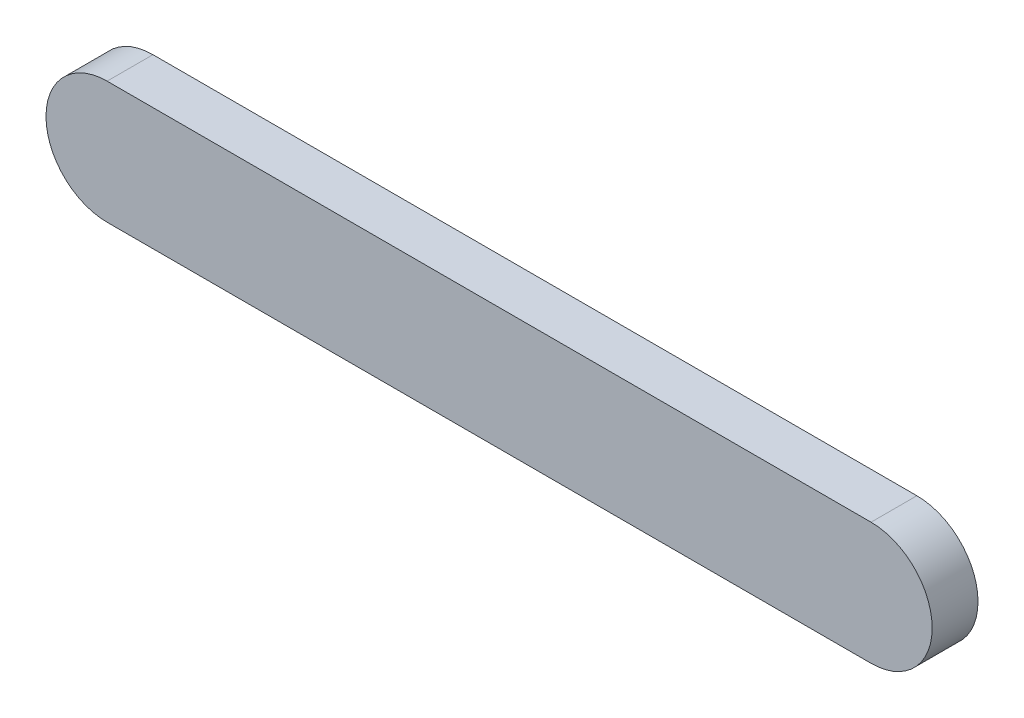
ISO-10303-21;
HEADER;
FILE_DESCRIPTION(('STEP AP214'),'2;1');
FILE_NAME('part.step','',(''),(''),'','','');
FILE_SCHEMA(('AUTOMOTIVE_DESIGN { 1 0 10303 214 1 1 1 1 }'));
ENDSEC;
DATA;
#1=APPLICATION_CONTEXT('core data for automotive mechanical design processes');
#2=APPLICATION_PROTOCOL_DEFINITION('international standard','automotive_design',2000,#1);
#3=PRODUCT_CONTEXT('',#1,'mechanical');
#4=PRODUCT('Part','Part','',(#3));
#5=PRODUCT_RELATED_PRODUCT_CATEGORY('part','',(#4));
#6=PRODUCT_DEFINITION_FORMATION('','',#4);
#7=PRODUCT_DEFINITION_CONTEXT('part definition',#1,'design');
#8=PRODUCT_DEFINITION('design','',#6,#7);
#9=PRODUCT_DEFINITION_SHAPE('','',#8);
#10=(LENGTH_UNIT() NAMED_UNIT(*) SI_UNIT(.MILLI.,.METRE.));
#11=(NAMED_UNIT(*) PLANE_ANGLE_UNIT() SI_UNIT($,.RADIAN.));
#12=(NAMED_UNIT(*) SI_UNIT($,.STERADIAN.) SOLID_ANGLE_UNIT());
#13=UNCERTAINTY_MEASURE_WITH_UNIT(LENGTH_MEASURE(1.E-05),#10,'distance_accuracy_value','');
#14=(GEOMETRIC_REPRESENTATION_CONTEXT(3) GLOBAL_UNCERTAINTY_ASSIGNED_CONTEXT((#13)) GLOBAL_UNIT_ASSIGNED_CONTEXT((#10,
#11,#12)) REPRESENTATION_CONTEXT('',''));
#15=CARTESIAN_POINT('',(0.,0.,0.));
#16=DIRECTION('',(0.,0.,1.));
#17=DIRECTION('',(1.,0.,0.));
#18=AXIS2_PLACEMENT_3D('',#15,#16,#17);
#19=CARTESIAN_POINT('',(-10.9275680142385,-0.153496058988036,3.));
#20=DIRECTION('',(0.,0.,-1.));
#21=DIRECTION('',(-1.,0.,0.));
#22=AXIS2_PLACEMENT_3D('',#19,#20,#21);
#23=CYLINDRICAL_SURFACE('',#22,4.);
#24=CARTESIAN_POINT('',(-10.9275680142385,-0.153496058988036,0.));
#25=DIRECTION('',(0.,0.,1.));
#26=DIRECTION('',(1.,0.,0.));
#27=AXIS2_PLACEMENT_3D('',#24,#25,#26);
#28=CIRCLE('',#27,4.);
#29=CARTESIAN_POINT('',(-10.9275680142385,3.84650394101196,0.));
#30=VERTEX_POINT('',#29);
#31=CARTESIAN_POINT('',(-10.9275680142385,-4.15349605898804,0.));
#32=VERTEX_POINT('',#31);
#33=EDGE_CURVE('E73',#30,#32,#28,.T.);
#34=ORIENTED_EDGE('',*,*,#33,.T.);
#35=DIRECTION('',(0.,0.,-1.));
#36=VECTOR('',#35,1.);
#37=CARTESIAN_POINT('',(-10.9275680142385,-4.15349605898804,3.));
#38=LINE('',#37,#36);
#39=CARTESIAN_POINT('',(-10.9275680142385,-4.15349605898804,3.));
#40=VERTEX_POINT('',#39);
#41=EDGE_CURVE('E11',#40,#32,#38,.T.);
#42=ORIENTED_EDGE('',*,*,#41,.F.);
#43=CARTESIAN_POINT('',(-10.9275680142385,-0.153496058988036,3.));
#44=DIRECTION('',(0.,0.,1.));
#45=DIRECTION('',(1.,0.,0.));
#46=AXIS2_PLACEMENT_3D('',#43,#44,#45);
#47=CIRCLE('',#46,4.);
#48=CARTESIAN_POINT('',(-10.9275680142385,3.84650394101196,3.));
#49=VERTEX_POINT('',#48);
#50=EDGE_CURVE('E91',#49,#40,#47,.T.);
#51=ORIENTED_EDGE('',*,*,#50,.F.);
#52=DIRECTION('',(0.,0.,-1.));
#53=VECTOR('',#52,1.);
#54=CARTESIAN_POINT('',(-10.9275680142385,3.84650394101196,3.));
#55=LINE('',#54,#53);
#56=EDGE_CURVE('E85',#49,#30,#55,.T.);
#57=ORIENTED_EDGE('',*,*,#56,.T.);
#58=EDGE_LOOP('',(#34,#42,#51,#57));
#59=FACE_BOUND('',#58,.T.);
#60=ADVANCED_FACE('F29',(#59),#23,.T.);
#61=CARTESIAN_POINT('',(-10.9275680142385,-4.15349605898804,3.));
#62=DIRECTION('',(0.,1.,0.));
#63=DIRECTION('',(0.,0.,1.));
#64=AXIS2_PLACEMENT_3D('',#61,#62,#63);
#65=PLANE('',#64);
#66=DIRECTION('',(1.,0.,0.));
#67=VECTOR('',#66,1.);
#68=CARTESIAN_POINT('',(-10.9275680142385,-4.15349605898804,0.));
#69=LINE('',#68,#67);
#70=CARTESIAN_POINT('',(39.0724319857615,-4.15349605898804,0.));
#71=VERTEX_POINT('',#70);
#72=EDGE_CURVE('E69',#32,#71,#69,.T.);
#73=ORIENTED_EDGE('',*,*,#72,.T.);
#74=DIRECTION('',(0.,0.,-1.));
#75=VECTOR('',#74,1.);
#76=CARTESIAN_POINT('',(39.0724319857615,-4.15349605898804,3.));
#77=LINE('',#76,#75);
#78=CARTESIAN_POINT('',(39.0724319857615,-4.15349605898804,3.));
#79=VERTEX_POINT('',#78);
#80=EDGE_CURVE('E36',#79,#71,#77,.T.);
#81=ORIENTED_EDGE('',*,*,#80,.F.);
#82=DIRECTION('',(1.,0.,0.));
#83=VECTOR('',#82,1.);
#84=CARTESIAN_POINT('',(-10.9275680142385,-4.15349605898804,3.));
#85=LINE('',#84,#83);
#86=EDGE_CURVE('E81',#40,#79,#85,.T.);
#87=ORIENTED_EDGE('',*,*,#86,.F.);
#88=ORIENTED_EDGE('',*,*,#41,.T.);
#89=EDGE_LOOP('',(#73,#81,#87,#88));
#90=FACE_BOUND('',#89,.T.);
#91=ADVANCED_FACE('F80',(#90),#65,.F.);
#92=CARTESIAN_POINT('',(39.0724319857615,-0.153496058988036,3.));
#93=DIRECTION('',(0.,0.,-1.));
#94=DIRECTION('',(-1.,0.,0.));
#95=AXIS2_PLACEMENT_3D('',#92,#93,#94);
#96=CYLINDRICAL_SURFACE('',#95,4.);
#97=CARTESIAN_POINT('',(39.0724319857615,-0.153496058988036,0.));
#98=DIRECTION('',(0.,0.,1.));
#99=DIRECTION('',(1.,0.,0.));
#100=AXIS2_PLACEMENT_3D('',#97,#98,#99);
#101=CIRCLE('',#100,4.);
#102=CARTESIAN_POINT('',(39.0724319857615,3.84650394101196,0.));
#103=VERTEX_POINT('',#102);
#104=EDGE_CURVE('E74',#71,#103,#101,.T.);
#105=ORIENTED_EDGE('',*,*,#104,.T.);
#106=DIRECTION('',(0.,0.,-1.));
#107=VECTOR('',#106,1.);
#108=CARTESIAN_POINT('',(39.0724319857615,3.84650394101196,3.));
#109=LINE('',#108,#107);
#110=CARTESIAN_POINT('',(39.0724319857615,3.84650394101196,3.));
#111=VERTEX_POINT('',#110);
#112=EDGE_CURVE('E97',#111,#103,#109,.T.);
#113=ORIENTED_EDGE('',*,*,#112,.F.);
#114=CARTESIAN_POINT('',(39.0724319857615,-0.153496058988036,3.));
#115=DIRECTION('',(0.,0.,1.));
#116=DIRECTION('',(1.,0.,0.));
#117=AXIS2_PLACEMENT_3D('',#114,#115,#116);
#118=CIRCLE('',#117,4.);
#119=EDGE_CURVE('E48',#79,#111,#118,.T.);
#120=ORIENTED_EDGE('',*,*,#119,.F.);
#121=ORIENTED_EDGE('',*,*,#80,.T.);
#122=EDGE_LOOP('',(#105,#113,#120,#121));
#123=FACE_BOUND('',#122,.T.);
#124=ADVANCED_FACE('F100',(#123),#96,.T.);
#125=CARTESIAN_POINT('',(-10.9275680142385,3.84650394101196,3.));
#126=DIRECTION('',(0.,-1.,0.));
#127=DIRECTION('',(0.,0.,-1.));
#128=AXIS2_PLACEMENT_3D('',#125,#126,#127);
#129=PLANE('',#128);
#130=DIRECTION('',(-1.,0.,0.));
#131=VECTOR('',#130,1.);
#132=CARTESIAN_POINT('',(-10.9275680142385,3.84650394101196,0.));
#133=LINE('',#132,#131);
#134=EDGE_CURVE('E89',#103,#30,#133,.T.);
#135=ORIENTED_EDGE('',*,*,#134,.T.);
#136=ORIENTED_EDGE('',*,*,#56,.F.);
#137=DIRECTION('',(-1.,0.,0.));
#138=VECTOR('',#137,1.);
#139=CARTESIAN_POINT('',(-10.9275680142385,3.84650394101196,3.));
#140=LINE('',#139,#138);
#141=EDGE_CURVE('E43',#111,#49,#140,.T.);
#142=ORIENTED_EDGE('',*,*,#141,.F.);
#143=ORIENTED_EDGE('',*,*,#112,.T.);
#144=EDGE_LOOP('',(#135,#136,#142,#143));
#145=FACE_BOUND('',#144,.T.);
#146=ADVANCED_FACE('F102',(#145),#129,.F.);
#147=CARTESIAN_POINT('',(-10.9275680142385,-0.153496058988036,3.));
#148=DIRECTION('',(0.,0.,1.));
#149=DIRECTION('',(1.,0.,0.));
#150=AXIS2_PLACEMENT_3D('',#147,#148,#149);
#151=PLANE('',#150);
#152=ORIENTED_EDGE('',*,*,#50,.T.);
#153=ORIENTED_EDGE('',*,*,#86,.T.);
#154=ORIENTED_EDGE('',*,*,#119,.T.);
#155=ORIENTED_EDGE('',*,*,#141,.T.);
#156=EDGE_LOOP('',(#152,#153,#154,#155));
#157=FACE_BOUND('',#156,.T.);
#158=ADVANCED_FACE('F103',(#157),#151,.T.);
#159=CARTESIAN_POINT('',(-10.9275680142385,-0.153496058988036,0.));
#160=DIRECTION('',(0.,0.,1.));
#161=DIRECTION('',(1.,0.,0.));
#162=AXIS2_PLACEMENT_3D('',#159,#160,#161);
#163=PLANE('',#162);
#164=ORIENTED_EDGE('',*,*,#33,.F.);
#165=ORIENTED_EDGE('',*,*,#134,.F.);
#166=ORIENTED_EDGE('',*,*,#104,.F.);
#167=ORIENTED_EDGE('',*,*,#72,.F.);
#168=EDGE_LOOP('',(#164,#165,#166,#167));
#169=FACE_BOUND('',#168,.T.);
#170=ADVANCED_FACE('F70',(#169),#163,.F.);
#171=CLOSED_SHELL('',(#60,#91,#124,#146,#158,#170));
#172=MANIFOLD_SOLID_BREP('B2',#171);
#173=ADVANCED_BREP_SHAPE_REPRESENTATION('',(#18,#172),#14);
#174=SHAPE_DEFINITION_REPRESENTATION(#9,#173);
ENDSEC;
END-ISO-10303-21;
